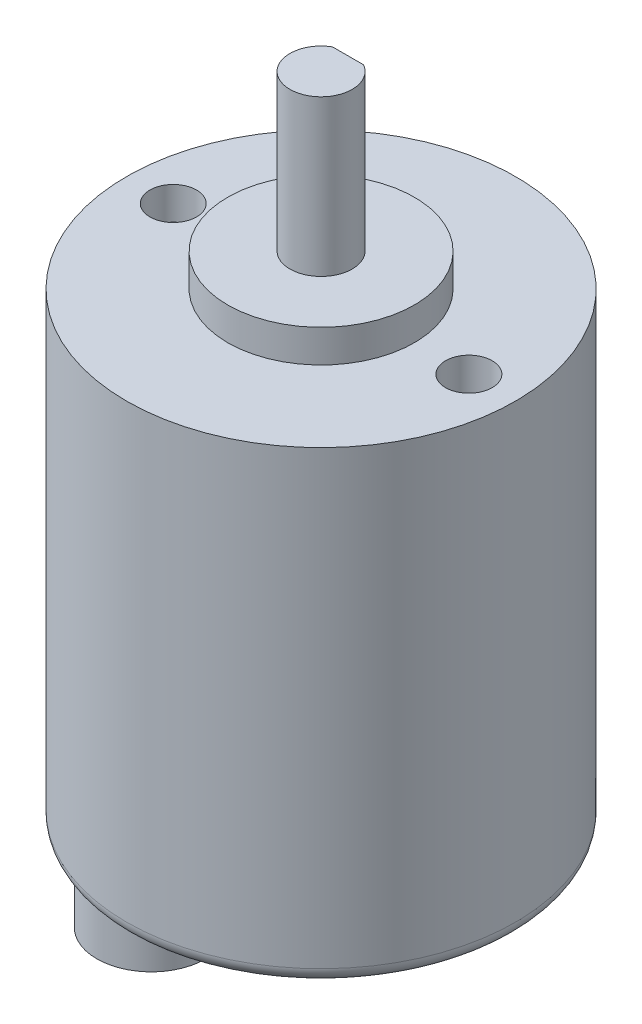
ISO-10303-21;
HEADER;
FILE_DESCRIPTION(('STEP AP214'),'2;1');
FILE_NAME('part.step','',(''),(''),'','','');
FILE_SCHEMA(('AUTOMOTIVE_DESIGN { 1 0 10303 214 1 1 1 1 }'));
ENDSEC;
DATA;
#1=APPLICATION_CONTEXT('core data for automotive mechanical design processes');
#2=APPLICATION_PROTOCOL_DEFINITION('international standard','automotive_design',2000,#1);
#3=PRODUCT_CONTEXT('',#1,'mechanical');
#4=PRODUCT('Part','Part','',(#3));
#5=PRODUCT_RELATED_PRODUCT_CATEGORY('part','',(#4));
#6=PRODUCT_DEFINITION_FORMATION('','',#4);
#7=PRODUCT_DEFINITION_CONTEXT('part definition',#1,'design');
#8=PRODUCT_DEFINITION('design','',#6,#7);
#9=PRODUCT_DEFINITION_SHAPE('','',#8);
#10=(LENGTH_UNIT() NAMED_UNIT(*) SI_UNIT(.MILLI.,.METRE.));
#11=(NAMED_UNIT(*) PLANE_ANGLE_UNIT() SI_UNIT($,.RADIAN.));
#12=(NAMED_UNIT(*) SI_UNIT($,.STERADIAN.) SOLID_ANGLE_UNIT());
#13=UNCERTAINTY_MEASURE_WITH_UNIT(LENGTH_MEASURE(1.E-05),#10,'distance_accuracy_value','');
#14=(GEOMETRIC_REPRESENTATION_CONTEXT(3) GLOBAL_UNCERTAINTY_ASSIGNED_CONTEXT((#13)) GLOBAL_UNIT_ASSIGNED_CONTEXT((#10,
#11,#12)) REPRESENTATION_CONTEXT('',''));
#15=CARTESIAN_POINT('',(0.,0.,0.));
#16=DIRECTION('',(0.,0.,1.));
#17=DIRECTION('',(1.,0.,0.));
#18=AXIS2_PLACEMENT_3D('',#15,#16,#17);
#19=CARTESIAN_POINT('',(0.,0.,0.));
#20=DIRECTION('',(0.,1.,0.));
#21=DIRECTION('',(0.,0.,1.));
#22=AXIS2_PLACEMENT_3D('',#19,#20,#21);
#23=PLANE('',#22);
#24=CARTESIAN_POINT('',(0.,0.,0.));
#25=DIRECTION('',(0.,1.,0.));
#26=DIRECTION('',(0.,0.,1.));
#27=AXIS2_PLACEMENT_3D('',#24,#25,#26);
#28=CIRCLE('',#27,11.5);
#29=CARTESIAN_POINT('',(0.,0.,11.5));
#30=VERTEX_POINT('',#29);
#31=EDGE_CURVE('E44',#30,#30,#28,.F.);
#32=ORIENTED_EDGE('',*,*,#31,.T.);
#33=EDGE_LOOP('',(#32));
#34=FACE_BOUND('',#33,.T.);
#35=CARTESIAN_POINT('',(-6.91367046498994,0.,3.99671382288494));
#36=DIRECTION('',(0.,1.,0.));
#37=DIRECTION('',(0.,0.,1.));
#38=AXIS2_PLACEMENT_3D('',#35,#36,#37);
#39=CIRCLE('',#38,3.5);
#40=CARTESIAN_POINT('',(-6.91367046498994,0.,7.49671382288494));
#41=VERTEX_POINT('',#40);
#42=EDGE_CURVE('E11',#41,#41,#39,.F.);
#43=ORIENTED_EDGE('',*,*,#42,.F.);
#44=EDGE_LOOP('',(#43));
#45=FACE_BOUND('',#44,.T.);
#46=ADVANCED_FACE('F36',(#34,#45),#23,.F.);
#47=CARTESIAN_POINT('',(0.,32.1,0.));
#48=DIRECTION('',(0.,1.,0.));
#49=DIRECTION('',(0.,0.,1.));
#50=AXIS2_PLACEMENT_3D('',#47,#48,#49);
#51=PLANE('',#50);
#52=CARTESIAN_POINT('',(0.,32.1,0.));
#53=DIRECTION('',(0.,1.,0.));
#54=DIRECTION('',(0.,0.,1.));
#55=AXIS2_PLACEMENT_3D('',#52,#53,#54);
#56=CIRCLE('',#55,6.);
#57=CARTESIAN_POINT('',(0.,32.1,6.));
#58=VERTEX_POINT('',#57);
#59=EDGE_CURVE('E96',#58,#58,#56,.T.);
#60=ORIENTED_EDGE('',*,*,#59,.T.);
#61=EDGE_LOOP('',(#60));
#62=FACE_BOUND('',#61,.T.);
#63=CARTESIAN_POINT('',(0.,32.1,0.));
#64=DIRECTION('',(0.,1.,0.));
#65=DIRECTION('',(0.,0.,1.));
#66=AXIS2_PLACEMENT_3D('',#63,#64,#65);
#67=CIRCLE('',#66,2.);
#68=CARTESIAN_POINT('',(0.,32.1,2.));
#69=VERTEX_POINT('',#68);
#70=EDGE_CURVE('E75',#69,#69,#67,.T.);
#71=ORIENTED_EDGE('',*,*,#70,.F.);
#72=EDGE_LOOP('',(#71));
#73=FACE_BOUND('',#72,.T.);
#74=ADVANCED_FACE('F124',(#62,#73),#51,.T.);
#75=CARTESIAN_POINT('',(0.,30.,0.));
#76=DIRECTION('',(0.,1.,0.));
#77=DIRECTION('',(0.,0.,1.));
#78=AXIS2_PLACEMENT_3D('',#75,#76,#77);
#79=PLANE('',#78);
#80=CARTESIAN_POINT('',(9.5,30.,0.));
#81=DIRECTION('',(0.,1.,0.));
#82=DIRECTION('',(0.,0.,1.));
#83=AXIS2_PLACEMENT_3D('',#80,#81,#82);
#84=CIRCLE('',#83,1.5);
#85=CARTESIAN_POINT('',(9.5,30.,1.5));
#86=VERTEX_POINT('',#85);
#87=EDGE_CURVE('E78',#86,#86,#84,.T.);
#88=ORIENTED_EDGE('',*,*,#87,.F.);
#89=EDGE_LOOP('',(#88));
#90=FACE_BOUND('',#89,.T.);
#91=CARTESIAN_POINT('',(-9.5,30.,0.));
#92=DIRECTION('',(0.,1.,0.));
#93=DIRECTION('',(0.,0.,1.));
#94=AXIS2_PLACEMENT_3D('',#91,#92,#93);
#95=CIRCLE('',#94,1.5);
#96=CARTESIAN_POINT('',(-9.5,30.,1.5));
#97=VERTEX_POINT('',#96);
#98=EDGE_CURVE('E88',#97,#97,#95,.T.);
#99=ORIENTED_EDGE('',*,*,#98,.F.);
#100=EDGE_LOOP('',(#99));
#101=FACE_BOUND('',#100,.T.);
#102=CARTESIAN_POINT('',(0.,30.,0.));
#103=DIRECTION('',(0.,1.,0.));
#104=DIRECTION('',(0.,0.,1.));
#105=AXIS2_PLACEMENT_3D('',#102,#103,#104);
#106=CIRCLE('',#105,12.5);
#107=CARTESIAN_POINT('',(0.,30.,12.5));
#108=VERTEX_POINT('',#107);
#109=EDGE_CURVE('E99',#108,#108,#106,.T.);
#110=ORIENTED_EDGE('',*,*,#109,.T.);
#111=EDGE_LOOP('',(#110));
#112=FACE_BOUND('',#111,.T.);
#113=CARTESIAN_POINT('',(0.,30.,0.));
#114=DIRECTION('',(0.,1.,0.));
#115=DIRECTION('',(0.,0.,1.));
#116=AXIS2_PLACEMENT_3D('',#113,#114,#115);
#117=CIRCLE('',#116,6.);
#118=CARTESIAN_POINT('',(0.,30.,6.));
#119=VERTEX_POINT('',#118);
#120=EDGE_CURVE('E93',#119,#119,#117,.T.);
#121=ORIENTED_EDGE('',*,*,#120,.F.);
#122=EDGE_LOOP('',(#121));
#123=FACE_BOUND('',#122,.T.);
#124=ADVANCED_FACE('F119',(#90,#101,#112,#123),#79,.T.);
#125=CARTESIAN_POINT('',(0.,30.,0.));
#126=DIRECTION('',(0.,-1.,0.));
#127=DIRECTION('',(0.,0.,-1.));
#128=AXIS2_PLACEMENT_3D('',#125,#126,#127);
#129=CYLINDRICAL_SURFACE('',#128,12.5);
#130=CARTESIAN_POINT('',(0.,1.,0.));
#131=DIRECTION('',(0.,1.,0.));
#132=DIRECTION('',(0.,0.,1.));
#133=AXIS2_PLACEMENT_3D('',#130,#131,#132);
#134=CIRCLE('',#133,12.5);
#135=CARTESIAN_POINT('',(0.,1.,12.5));
#136=VERTEX_POINT('',#135);
#137=EDGE_CURVE('E104',#136,#136,#134,.T.);
#138=ORIENTED_EDGE('',*,*,#137,.T.);
#139=EDGE_LOOP('',(#138));
#140=FACE_BOUND('',#139,.T.);
#141=ORIENTED_EDGE('',*,*,#109,.F.);
#142=EDGE_LOOP('',(#141));
#143=FACE_BOUND('',#142,.T.);
#144=ADVANCED_FACE('F114',(#140,#143),#129,.T.);
#145=CARTESIAN_POINT('',(0.,1.,0.));
#146=DIRECTION('',(0.,1.,0.));
#147=DIRECTION('',(0.,0.,1.));
#148=AXIS2_PLACEMENT_3D('',#145,#146,#147);
#149=TOROIDAL_SURFACE('',#148,11.5,1.);
#150=ORIENTED_EDGE('',*,*,#31,.F.);
#151=EDGE_LOOP('',(#150));
#152=FACE_BOUND('',#151,.T.);
#153=ORIENTED_EDGE('',*,*,#137,.F.);
#154=EDGE_LOOP('',(#153));
#155=FACE_BOUND('',#154,.T.);
#156=ADVANCED_FACE('F38',(#152,#155),#149,.T.);
#157=CARTESIAN_POINT('',(0.,32.1,0.));
#158=DIRECTION('',(0.,-1.,0.));
#159=DIRECTION('',(0.,0.,-1.));
#160=AXIS2_PLACEMENT_3D('',#157,#158,#159);
#161=CYLINDRICAL_SURFACE('',#160,6.);
#162=ORIENTED_EDGE('',*,*,#59,.F.);
#163=EDGE_LOOP('',(#162));
#164=FACE_BOUND('',#163,.T.);
#165=ORIENTED_EDGE('',*,*,#120,.T.);
#166=EDGE_LOOP('',(#165));
#167=FACE_BOUND('',#166,.T.);
#168=ADVANCED_FACE('F113',(#164,#167),#161,.T.);
#169=CARTESIAN_POINT('',(-9.5,27.9,0.));
#170=DIRECTION('',(0.,1.,0.));
#171=DIRECTION('',(0.,0.,1.));
#172=AXIS2_PLACEMENT_3D('',#169,#170,#171);
#173=CYLINDRICAL_SURFACE('',#172,1.5);
#174=CARTESIAN_POINT('',(-9.5,27.9,0.));
#175=DIRECTION('',(0.,1.,0.));
#176=DIRECTION('',(0.,0.,1.));
#177=AXIS2_PLACEMENT_3D('',#174,#175,#176);
#178=CIRCLE('',#177,1.5);
#179=CARTESIAN_POINT('',(-9.5,27.9,1.5));
#180=VERTEX_POINT('',#179);
#181=EDGE_CURVE('E90',#180,#180,#178,.T.);
#182=ORIENTED_EDGE('',*,*,#181,.F.);
#183=EDGE_LOOP('',(#182));
#184=FACE_BOUND('',#183,.T.);
#185=ORIENTED_EDGE('',*,*,#98,.T.);
#186=EDGE_LOOP('',(#185));
#187=FACE_BOUND('',#186,.T.);
#188=ADVANCED_FACE('F130',(#184,#187),#173,.F.);
#189=CARTESIAN_POINT('',(-9.5,27.9,0.));
#190=DIRECTION('',(0.,1.,0.));
#191=DIRECTION('',(0.,0.,1.));
#192=AXIS2_PLACEMENT_3D('',#189,#190,#191);
#193=PLANE('',#192);
#194=ORIENTED_EDGE('',*,*,#181,.T.);
#195=EDGE_LOOP('',(#194));
#196=FACE_BOUND('',#195,.T.);
#197=ADVANCED_FACE('F136',(#196),#193,.T.);
#198=CARTESIAN_POINT('',(9.5,27.9,0.));
#199=DIRECTION('',(0.,1.,0.));
#200=DIRECTION('',(0.,0.,1.));
#201=AXIS2_PLACEMENT_3D('',#198,#199,#200);
#202=CYLINDRICAL_SURFACE('',#201,1.5);
#203=CARTESIAN_POINT('',(9.5,27.9,0.));
#204=DIRECTION('',(0.,1.,0.));
#205=DIRECTION('',(0.,0.,1.));
#206=AXIS2_PLACEMENT_3D('',#203,#204,#205);
#207=CIRCLE('',#206,1.5);
#208=CARTESIAN_POINT('',(9.5,27.9,1.5));
#209=VERTEX_POINT('',#208);
#210=EDGE_CURVE('E81',#209,#209,#207,.T.);
#211=ORIENTED_EDGE('',*,*,#210,.F.);
#212=EDGE_LOOP('',(#211));
#213=FACE_BOUND('',#212,.T.);
#214=ORIENTED_EDGE('',*,*,#87,.T.);
#215=EDGE_LOOP('',(#214));
#216=FACE_BOUND('',#215,.T.);
#217=ADVANCED_FACE('F153',(#213,#216),#202,.F.);
#218=CARTESIAN_POINT('',(9.5,27.9,0.));
#219=DIRECTION('',(0.,1.,0.));
#220=DIRECTION('',(0.,0.,1.));
#221=AXIS2_PLACEMENT_3D('',#218,#219,#220);
#222=PLANE('',#221);
#223=ORIENTED_EDGE('',*,*,#210,.T.);
#224=EDGE_LOOP('',(#223));
#225=FACE_BOUND('',#224,.T.);
#226=ADVANCED_FACE('F157',(#225),#222,.T.);
#227=CARTESIAN_POINT('',(0.,42.1,0.));
#228=DIRECTION('',(0.,-1.,0.));
#229=DIRECTION('',(0.,0.,-1.));
#230=AXIS2_PLACEMENT_3D('',#227,#228,#229);
#231=CYLINDRICAL_SURFACE('',#230,2.);
#232=CARTESIAN_POINT('',(0.,42.1,0.));
#233=DIRECTION('',(0.,1.,0.));
#234=DIRECTION('',(0.,0.,1.));
#235=AXIS2_PLACEMENT_3D('',#232,#233,#234);
#236=CIRCLE('',#235,2.);
#237=CARTESIAN_POINT('',(-0.997298949861149,42.1,-1.73360745401197));
#238=VERTEX_POINT('',#237);
#239=CARTESIAN_POINT('',(0.997298949861149,42.1,-1.73360745401197));
#240=VERTEX_POINT('',#239);
#241=EDGE_CURVE('E74',#238,#240,#236,.T.);
#242=ORIENTED_EDGE('',*,*,#241,.F.);
#243=DIRECTION('',(0.,1.,0.));
#244=VECTOR('',#243,1.);
#245=CARTESIAN_POINT('',(-0.997298949861149,35.1,-1.73360745401197));
#246=LINE('',#245,#244);
#247=CARTESIAN_POINT('',(-0.997298949861149,35.1,-1.73360745401197));
#248=VERTEX_POINT('',#247);
#249=EDGE_CURVE('E51',#248,#238,#246,.T.);
#250=ORIENTED_EDGE('',*,*,#249,.F.);
#251=CARTESIAN_POINT('',(0.,35.1,0.));
#252=DIRECTION('',(0.,1.,0.));
#253=DIRECTION('',(0.,0.,1.));
#254=AXIS2_PLACEMENT_3D('',#251,#252,#253);
#255=CIRCLE('',#254,2.);
#256=CARTESIAN_POINT('',(0.997298949861149,35.1,-1.73360745401197));
#257=VERTEX_POINT('',#256);
#258=EDGE_CURVE('E67',#257,#248,#255,.T.);
#259=ORIENTED_EDGE('',*,*,#258,.F.);
#260=DIRECTION('',(0.,1.,0.));
#261=VECTOR('',#260,1.);
#262=CARTESIAN_POINT('',(0.997298949861149,35.1,-1.73360745401197));
#263=LINE('',#262,#261);
#264=EDGE_CURVE('E57',#257,#240,#263,.T.);
#265=ORIENTED_EDGE('',*,*,#264,.T.);
#266=EDGE_LOOP('',(#242,#250,#259,#265));
#267=FACE_BOUND('',#266,.T.);
#268=ORIENTED_EDGE('',*,*,#70,.T.);
#269=EDGE_LOOP('',(#268));
#270=FACE_BOUND('',#269,.T.);
#271=ADVANCED_FACE('F72',(#267,#270),#231,.T.);
#272=CARTESIAN_POINT('',(0.,42.1,0.));
#273=DIRECTION('',(0.,1.,0.));
#274=DIRECTION('',(0.,0.,1.));
#275=AXIS2_PLACEMENT_3D('',#272,#273,#274);
#276=PLANE('',#275);
#277=DIRECTION('',(1.,0.,0.));
#278=VECTOR('',#277,1.);
#279=CARTESIAN_POINT('',(0.,42.1,-1.73360745401197));
#280=LINE('',#279,#278);
#281=EDGE_CURVE('E62',#238,#240,#280,.T.);
#282=ORIENTED_EDGE('',*,*,#281,.F.);
#283=ORIENTED_EDGE('',*,*,#241,.T.);
#284=EDGE_LOOP('',(#282,#283));
#285=FACE_BOUND('',#284,.T.);
#286=ADVANCED_FACE('F77',(#285),#276,.T.);
#287=CARTESIAN_POINT('',(0.,35.1,-1.73360745401197));
#288=DIRECTION('',(0.,0.,1.));
#289=DIRECTION('',(1.,0.,0.));
#290=AXIS2_PLACEMENT_3D('',#287,#288,#289);
#291=PLANE('',#290);
#292=ORIENTED_EDGE('',*,*,#281,.T.);
#293=ORIENTED_EDGE('',*,*,#264,.F.);
#294=DIRECTION('',(1.,0.,0.));
#295=VECTOR('',#294,1.);
#296=CARTESIAN_POINT('',(0.,35.1,-1.73360745401197));
#297=LINE('',#296,#295);
#298=EDGE_CURVE('E186',#248,#257,#297,.T.);
#299=ORIENTED_EDGE('',*,*,#298,.F.);
#300=ORIENTED_EDGE('',*,*,#249,.T.);
#301=EDGE_LOOP('',(#292,#293,#299,#300));
#302=FACE_BOUND('',#301,.T.);
#303=ADVANCED_FACE('F63',(#302),#291,.F.);
#304=CARTESIAN_POINT('',(0.,35.1,0.));
#305=DIRECTION('',(0.,1.,0.));
#306=DIRECTION('',(0.,0.,1.));
#307=AXIS2_PLACEMENT_3D('',#304,#305,#306);
#308=PLANE('',#307);
#309=ORIENTED_EDGE('',*,*,#258,.T.);
#310=ORIENTED_EDGE('',*,*,#298,.T.);
#311=EDGE_LOOP('',(#309,#310));
#312=FACE_BOUND('',#311,.T.);
#313=ADVANCED_FACE('F168',(#312),#308,.T.);
#314=CARTESIAN_POINT('',(-6.91367046498994,-7.,3.99671382288494));
#315=DIRECTION('',(0.,1.,0.));
#316=DIRECTION('',(0.,0.,1.));
#317=AXIS2_PLACEMENT_3D('',#314,#315,#316);
#318=CYLINDRICAL_SURFACE('',#317,3.5);
#319=CARTESIAN_POINT('',(-6.91367046498994,-7.,3.99671382288494));
#320=DIRECTION('',(0.,-1.,0.));
#321=DIRECTION('',(0.,0.,-1.));
#322=AXIS2_PLACEMENT_3D('',#319,#320,#321);
#323=CIRCLE('',#322,3.5);
#324=CARTESIAN_POINT('',(-6.91367046498994,-7.,0.496713822884941));
#325=VERTEX_POINT('',#324);
#326=EDGE_CURVE('E68',#325,#325,#323,.T.);
#327=ORIENTED_EDGE('',*,*,#326,.F.);
#328=EDGE_LOOP('',(#327));
#329=FACE_BOUND('',#328,.T.);
#330=ORIENTED_EDGE('',*,*,#42,.T.);
#331=EDGE_LOOP('',(#330));
#332=FACE_BOUND('',#331,.T.);
#333=ADVANCED_FACE('F171',(#329,#332),#318,.T.);
#334=CARTESIAN_POINT('',(-6.91367046498994,-7.,3.99671382288494));
#335=DIRECTION('',(0.,-1.,0.));
#336=DIRECTION('',(0.,0.,-1.));
#337=AXIS2_PLACEMENT_3D('',#334,#335,#336);
#338=PLANE('',#337);
#339=ORIENTED_EDGE('',*,*,#326,.T.);
#340=EDGE_LOOP('',(#339));
#341=FACE_BOUND('',#340,.T.);
#342=ADVANCED_FACE('F175',(#341),#338,.T.);
#343=CLOSED_SHELL('',(#46,#74,#124,#144,#156,#168,#188,#197,#217,#226,#271,#286,#303,#313,#333,#342));
#344=MANIFOLD_SOLID_BREP('B2',#343);
#345=ADVANCED_BREP_SHAPE_REPRESENTATION('',(#18,#344),#14);
#346=SHAPE_DEFINITION_REPRESENTATION(#9,#345);
ENDSEC;
END-ISO-10303-21;
